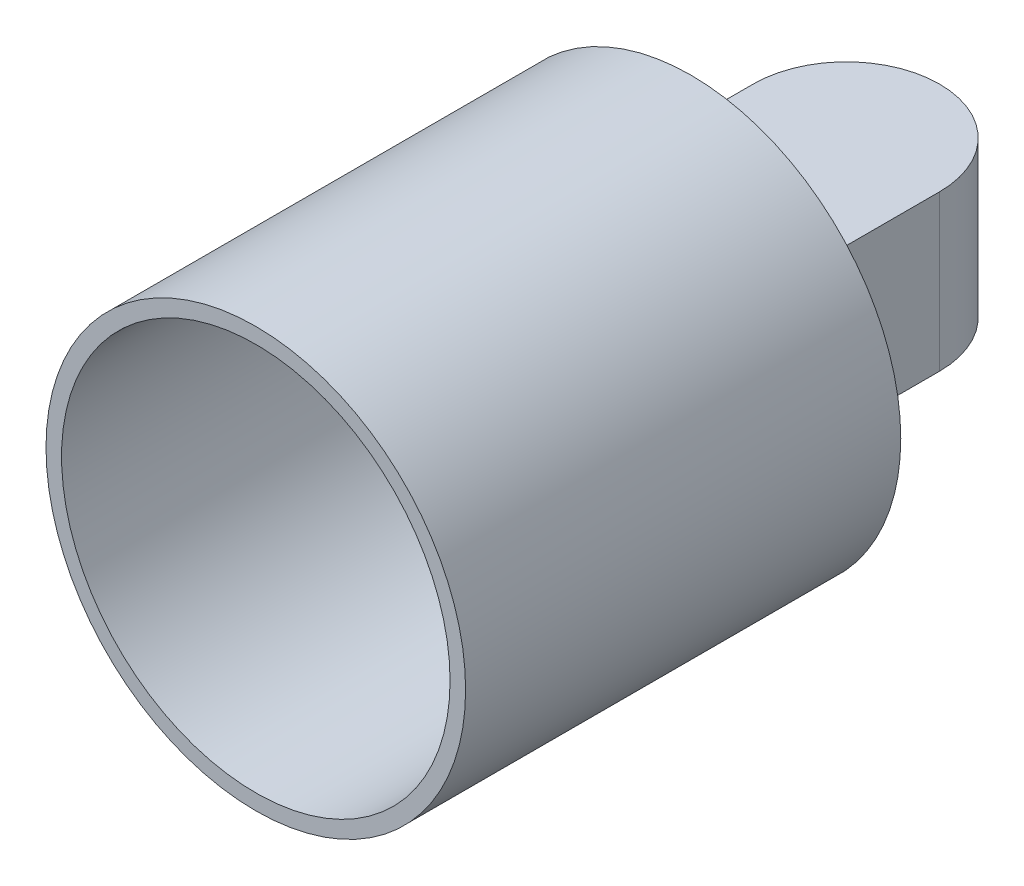
ISO-10303-21;
HEADER;
FILE_DESCRIPTION(('STEP AP214'),'2;1');
FILE_NAME('part.step','',(''),(''),'','','');
FILE_SCHEMA(('AUTOMOTIVE_DESIGN { 1 0 10303 214 1 1 1 1 }'));
ENDSEC;
DATA;
#1=APPLICATION_CONTEXT('core data for automotive mechanical design processes');
#2=APPLICATION_PROTOCOL_DEFINITION('international standard','automotive_design',2000,#1);
#3=PRODUCT_CONTEXT('',#1,'mechanical');
#4=PRODUCT('Part','Part','',(#3));
#5=PRODUCT_RELATED_PRODUCT_CATEGORY('part','',(#4));
#6=PRODUCT_DEFINITION_FORMATION('','',#4);
#7=PRODUCT_DEFINITION_CONTEXT('part definition',#1,'design');
#8=PRODUCT_DEFINITION('design','',#6,#7);
#9=PRODUCT_DEFINITION_SHAPE('','',#8);
#10=(LENGTH_UNIT() NAMED_UNIT(*) SI_UNIT(.MILLI.,.METRE.));
#11=(NAMED_UNIT(*) PLANE_ANGLE_UNIT() SI_UNIT($,.RADIAN.));
#12=(NAMED_UNIT(*) SI_UNIT($,.STERADIAN.) SOLID_ANGLE_UNIT());
#13=UNCERTAINTY_MEASURE_WITH_UNIT(LENGTH_MEASURE(1.E-05),#10,'distance_accuracy_value','');
#14=(GEOMETRIC_REPRESENTATION_CONTEXT(3) GLOBAL_UNCERTAINTY_ASSIGNED_CONTEXT((#13)) GLOBAL_UNIT_ASSIGNED_CONTEXT((#10,
#11,#12)) REPRESENTATION_CONTEXT('',''));
#15=CARTESIAN_POINT('',(0.,0.,0.));
#16=DIRECTION('',(0.,0.,1.));
#17=DIRECTION('',(1.,0.,0.));
#18=AXIS2_PLACEMENT_3D('',#15,#16,#17);
#19=CARTESIAN_POINT('',(0.,0.,-28.));
#20=DIRECTION('',(0.,0.,-1.));
#21=DIRECTION('',(-1.,0.,0.));
#22=AXIS2_PLACEMENT_3D('',#19,#20,#21);
#23=PLANE('',#22);
#24=CARTESIAN_POINT('',(0.,0.,-28.));
#25=DIRECTION('',(0.,0.,-1.));
#26=DIRECTION('',(-1.,0.,0.));
#27=AXIS2_PLACEMENT_3D('',#24,#25,#26);
#28=CIRCLE('',#27,13.5);
#29=CARTESIAN_POINT('',(-13.5,0.,-28.));
#30=VERTEX_POINT('',#29);
#31=EDGE_CURVE('E108',#30,#30,#28,.T.);
#32=ORIENTED_EDGE('',*,*,#31,.T.);
#33=EDGE_LOOP('',(#32));
#34=FACE_BOUND('',#33,.T.);
#35=DIRECTION('',(0.,1.,0.));
#36=VECTOR('',#35,1.);
#37=CARTESIAN_POINT('',(-6.,-5.,-28.));
#38=LINE('',#37,#36);
#39=CARTESIAN_POINT('',(-6.,-5.,-28.));
#40=VERTEX_POINT('',#39);
#41=CARTESIAN_POINT('',(-6.,5.,-28.));
#42=VERTEX_POINT('',#41);
#43=EDGE_CURVE('E51',#40,#42,#38,.T.);
#44=ORIENTED_EDGE('',*,*,#43,.F.);
#45=DIRECTION('',(1.,0.,0.));
#46=VECTOR('',#45,1.);
#47=CARTESIAN_POINT('',(-6.,-5.,-28.));
#48=LINE('',#47,#46);
#49=CARTESIAN_POINT('',(6.,-5.,-28.));
#50=VERTEX_POINT('',#49);
#51=EDGE_CURVE('E55',#40,#50,#48,.T.);
#52=ORIENTED_EDGE('',*,*,#51,.T.);
#53=DIRECTION('',(0.,1.,0.));
#54=VECTOR('',#53,1.);
#55=CARTESIAN_POINT('',(6.,-5.,-28.));
#56=LINE('',#55,#54);
#57=CARTESIAN_POINT('',(6.,5.,-28.));
#58=VERTEX_POINT('',#57);
#59=EDGE_CURVE('E72',#50,#58,#56,.T.);
#60=ORIENTED_EDGE('',*,*,#59,.T.);
#61=DIRECTION('',(1.,0.,0.));
#62=VECTOR('',#61,1.);
#63=CARTESIAN_POINT('',(-6.,5.,-28.));
#64=LINE('',#63,#62);
#65=EDGE_CURVE('E74',#42,#58,#64,.T.);
#66=ORIENTED_EDGE('',*,*,#65,.F.);
#67=EDGE_LOOP('',(#44,#52,#60,#66));
#68=FACE_BOUND('',#67,.T.);
#69=ADVANCED_FACE('F36',(#34,#68),#23,.T.);
#70=CARTESIAN_POINT('',(0.,0.,-25.));
#71=DIRECTION('',(0.,0.,1.));
#72=DIRECTION('',(1.,0.,0.));
#73=AXIS2_PLACEMENT_3D('',#70,#71,#72);
#74=CYLINDRICAL_SURFACE('',#73,13.5);
#75=CARTESIAN_POINT('',(0.,0.,0.));
#76=DIRECTION('',(0.,0.,1.));
#77=DIRECTION('',(1.,0.,0.));
#78=AXIS2_PLACEMENT_3D('',#75,#76,#77);
#79=CIRCLE('',#78,13.5);
#80=CARTESIAN_POINT('',(13.5,0.,0.));
#81=VERTEX_POINT('',#80);
#82=EDGE_CURVE('E11',#81,#81,#79,.T.);
#83=ORIENTED_EDGE('',*,*,#82,.F.);
#84=EDGE_LOOP('',(#83));
#85=FACE_BOUND('',#84,.T.);
#86=ORIENTED_EDGE('',*,*,#31,.F.);
#87=EDGE_LOOP('',(#86));
#88=FACE_BOUND('',#87,.T.);
#89=ADVANCED_FACE('F38',(#85,#88),#74,.T.);
#90=CARTESIAN_POINT('',(0.,0.,0.));
#91=DIRECTION('',(0.,0.,1.));
#92=DIRECTION('',(1.,0.,0.));
#93=AXIS2_PLACEMENT_3D('',#90,#91,#92);
#94=PLANE('',#93);
#95=CARTESIAN_POINT('',(0.,0.,0.));
#96=DIRECTION('',(0.,0.,1.));
#97=DIRECTION('',(1.,0.,0.));
#98=AXIS2_PLACEMENT_3D('',#95,#96,#97);
#99=CIRCLE('',#98,12.5);
#100=CARTESIAN_POINT('',(12.5,0.,0.));
#101=VERTEX_POINT('',#100);
#102=EDGE_CURVE('E113',#101,#101,#99,.T.);
#103=ORIENTED_EDGE('',*,*,#102,.F.);
#104=EDGE_LOOP('',(#103));
#105=FACE_BOUND('',#104,.T.);
#106=ORIENTED_EDGE('',*,*,#82,.T.);
#107=EDGE_LOOP('',(#106));
#108=FACE_BOUND('',#107,.T.);
#109=ADVANCED_FACE('F120',(#105,#108),#94,.T.);
#110=CARTESIAN_POINT('',(0.,0.,-25.));
#111=DIRECTION('',(0.,0.,1.));
#112=DIRECTION('',(1.,0.,0.));
#113=AXIS2_PLACEMENT_3D('',#110,#111,#112);
#114=CYLINDRICAL_SURFACE('',#113,12.5);
#115=CARTESIAN_POINT('',(0.,0.,-25.));
#116=DIRECTION('',(0.,0.,1.));
#117=DIRECTION('',(1.,0.,0.));
#118=AXIS2_PLACEMENT_3D('',#115,#116,#117);
#119=CIRCLE('',#118,12.5);
#120=CARTESIAN_POINT('',(12.5,0.,-25.));
#121=VERTEX_POINT('',#120);
#122=EDGE_CURVE('E44',#121,#121,#119,.T.);
#123=ORIENTED_EDGE('',*,*,#122,.F.);
#124=EDGE_LOOP('',(#123));
#125=FACE_BOUND('',#124,.T.);
#126=ORIENTED_EDGE('',*,*,#102,.T.);
#127=EDGE_LOOP('',(#126));
#128=FACE_BOUND('',#127,.T.);
#129=ADVANCED_FACE('F118',(#125,#128),#114,.F.);
#130=CARTESIAN_POINT('',(0.,0.,-25.));
#131=DIRECTION('',(0.,0.,-1.));
#132=DIRECTION('',(-1.,0.,0.));
#133=AXIS2_PLACEMENT_3D('',#130,#131,#132);
#134=PLANE('',#133);
#135=ORIENTED_EDGE('',*,*,#122,.T.);
#136=EDGE_LOOP('',(#135));
#137=FACE_BOUND('',#136,.T.);
#138=ADVANCED_FACE('F137',(#137),#134,.F.);
#139=CARTESIAN_POINT('',(-6.,-5.,-28.));
#140=DIRECTION('',(-1.,0.,0.));
#141=DIRECTION('',(0.,0.,1.));
#142=AXIS2_PLACEMENT_3D('',#139,#140,#141);
#143=PLANE('',#142);
#144=ORIENTED_EDGE('',*,*,#43,.T.);
#145=DIRECTION('',(0.,0.,1.));
#146=VECTOR('',#145,1.);
#147=CARTESIAN_POINT('',(-6.,5.,-28.));
#148=LINE('',#147,#146);
#149=CARTESIAN_POINT('',(-6.,5.,-38.));
#150=VERTEX_POINT('',#149);
#151=EDGE_CURVE('E89',#150,#42,#148,.T.);
#152=ORIENTED_EDGE('',*,*,#151,.F.);
#153=DIRECTION('',(0.,1.,0.));
#154=VECTOR('',#153,1.);
#155=CARTESIAN_POINT('',(-6.,-5.,-38.));
#156=LINE('',#155,#154);
#157=CARTESIAN_POINT('',(-6.,-5.,-38.));
#158=VERTEX_POINT('',#157);
#159=EDGE_CURVE('E106',#158,#150,#156,.T.);
#160=ORIENTED_EDGE('',*,*,#159,.F.);
#161=DIRECTION('',(0.,0.,1.));
#162=VECTOR('',#161,1.);
#163=CARTESIAN_POINT('',(-6.,-5.,-28.));
#164=LINE('',#163,#162);
#165=EDGE_CURVE('E94',#158,#40,#164,.T.);
#166=ORIENTED_EDGE('',*,*,#165,.T.);
#167=EDGE_LOOP('',(#144,#152,#160,#166));
#168=FACE_BOUND('',#167,.T.);
#169=ADVANCED_FACE('F135',(#168),#143,.T.);
#170=CARTESIAN_POINT('',(0.,-5.,-38.));
#171=DIRECTION('',(0.,1.,0.));
#172=DIRECTION('',(0.,0.,1.));
#173=AXIS2_PLACEMENT_3D('',#170,#171,#172);
#174=CYLINDRICAL_SURFACE('',#173,6.);
#175=ORIENTED_EDGE('',*,*,#159,.T.);
#176=CARTESIAN_POINT('',(0.,5.,-38.));
#177=DIRECTION('',(0.,1.,0.));
#178=DIRECTION('',(0.,0.,1.));
#179=AXIS2_PLACEMENT_3D('',#176,#177,#178);
#180=CIRCLE('',#179,6.);
#181=CARTESIAN_POINT('',(6.,5.,-38.));
#182=VERTEX_POINT('',#181);
#183=EDGE_CURVE('E92',#182,#150,#180,.T.);
#184=ORIENTED_EDGE('',*,*,#183,.F.);
#185=DIRECTION('',(0.,1.,0.));
#186=VECTOR('',#185,1.);
#187=CARTESIAN_POINT('',(6.,-5.,-38.));
#188=LINE('',#187,#186);
#189=CARTESIAN_POINT('',(6.,-5.,-38.));
#190=VERTEX_POINT('',#189);
#191=EDGE_CURVE('E79',#190,#182,#188,.T.);
#192=ORIENTED_EDGE('',*,*,#191,.F.);
#193=CARTESIAN_POINT('',(0.,-5.,-38.));
#194=DIRECTION('',(0.,1.,0.));
#195=DIRECTION('',(0.,0.,1.));
#196=AXIS2_PLACEMENT_3D('',#193,#194,#195);
#197=CIRCLE('',#196,6.);
#198=EDGE_CURVE('E103',#190,#158,#197,.T.);
#199=ORIENTED_EDGE('',*,*,#198,.T.);
#200=EDGE_LOOP('',(#175,#184,#192,#199));
#201=FACE_BOUND('',#200,.T.);
#202=ADVANCED_FACE('F159',(#201),#174,.T.);
#203=CARTESIAN_POINT('',(6.,-5.,-28.));
#204=DIRECTION('',(1.,0.,0.));
#205=DIRECTION('',(0.,0.,-1.));
#206=AXIS2_PLACEMENT_3D('',#203,#204,#205);
#207=PLANE('',#206);
#208=ORIENTED_EDGE('',*,*,#191,.T.);
#209=DIRECTION('',(0.,0.,-1.));
#210=VECTOR('',#209,1.);
#211=CARTESIAN_POINT('',(6.,5.,-28.));
#212=LINE('',#211,#210);
#213=EDGE_CURVE('E86',#58,#182,#212,.T.);
#214=ORIENTED_EDGE('',*,*,#213,.F.);
#215=ORIENTED_EDGE('',*,*,#59,.F.);
#216=DIRECTION('',(0.,0.,-1.));
#217=VECTOR('',#216,1.);
#218=CARTESIAN_POINT('',(6.,-5.,-28.));
#219=LINE('',#218,#217);
#220=EDGE_CURVE('E101',#50,#190,#219,.T.);
#221=ORIENTED_EDGE('',*,*,#220,.T.);
#222=EDGE_LOOP('',(#208,#214,#215,#221));
#223=FACE_BOUND('',#222,.T.);
#224=ADVANCED_FACE('F91',(#223),#207,.T.);
#225=CARTESIAN_POINT('',(0.,-5.,-38.));
#226=DIRECTION('',(0.,1.,0.));
#227=DIRECTION('',(0.,0.,1.));
#228=AXIS2_PLACEMENT_3D('',#225,#226,#227);
#229=PLANE('',#228);
#230=ORIENTED_EDGE('',*,*,#165,.F.);
#231=ORIENTED_EDGE('',*,*,#198,.F.);
#232=ORIENTED_EDGE('',*,*,#220,.F.);
#233=ORIENTED_EDGE('',*,*,#51,.F.);
#234=EDGE_LOOP('',(#230,#231,#232,#233));
#235=FACE_BOUND('',#234,.T.);
#236=ADVANCED_FACE('F173',(#235),#229,.F.);
#237=CARTESIAN_POINT('',(0.,5.,-38.));
#238=DIRECTION('',(0.,1.,0.));
#239=DIRECTION('',(0.,0.,1.));
#240=AXIS2_PLACEMENT_3D('',#237,#238,#239);
#241=PLANE('',#240);
#242=ORIENTED_EDGE('',*,*,#151,.T.);
#243=ORIENTED_EDGE('',*,*,#65,.T.);
#244=ORIENTED_EDGE('',*,*,#213,.T.);
#245=ORIENTED_EDGE('',*,*,#183,.T.);
#246=EDGE_LOOP('',(#242,#243,#244,#245));
#247=FACE_BOUND('',#246,.T.);
#248=ADVANCED_FACE('F84',(#247),#241,.T.);
#249=CLOSED_SHELL('',(#69,#89,#109,#129,#138,#169,#202,#224,#236,#248));
#250=MANIFOLD_SOLID_BREP('B2',#249);
#251=ADVANCED_BREP_SHAPE_REPRESENTATION('',(#18,#250),#14);
#252=SHAPE_DEFINITION_REPRESENTATION(#9,#251);
ENDSEC;
END-ISO-10303-21;
